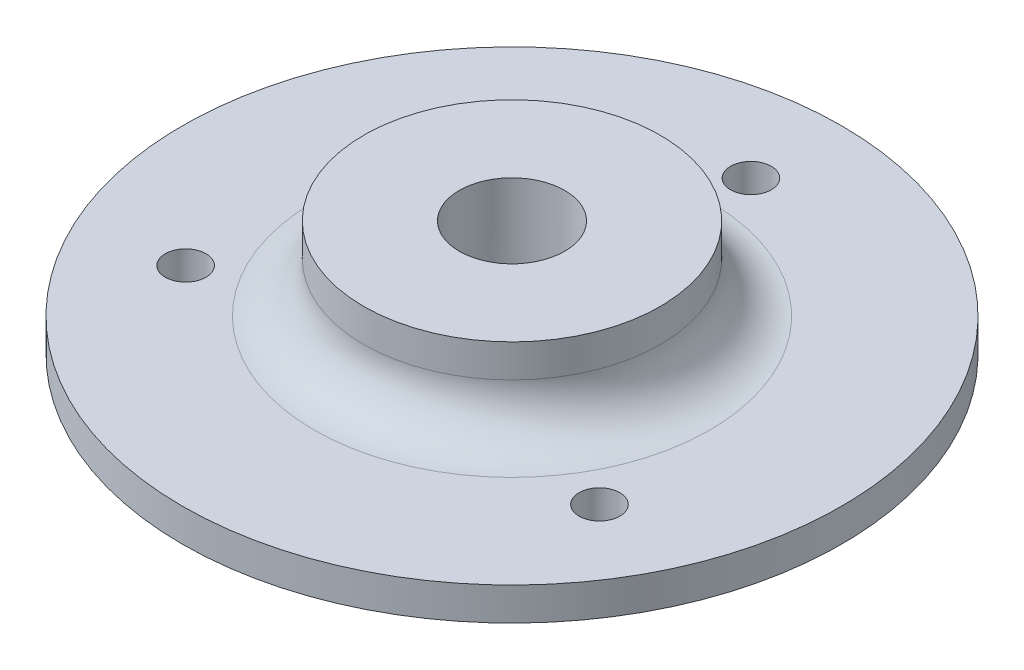
ISO-10303-21;
HEADER;
FILE_DESCRIPTION(('STEP AP214'),'2;1');
FILE_NAME('part.step','',(''),(''),'','','');
FILE_SCHEMA(('AUTOMOTIVE_DESIGN { 1 0 10303 214 1 1 1 1 }'));
ENDSEC;
DATA;
#1=APPLICATION_CONTEXT('core data for automotive mechanical design processes');
#2=APPLICATION_PROTOCOL_DEFINITION('international standard','automotive_design',2000,#1);
#3=PRODUCT_CONTEXT('',#1,'mechanical');
#4=PRODUCT('Part','Part','',(#3));
#5=PRODUCT_RELATED_PRODUCT_CATEGORY('part','',(#4));
#6=PRODUCT_DEFINITION_FORMATION('','',#4);
#7=PRODUCT_DEFINITION_CONTEXT('part definition',#1,'design');
#8=PRODUCT_DEFINITION('design','',#6,#7);
#9=PRODUCT_DEFINITION_SHAPE('','',#8);
#10=(LENGTH_UNIT() NAMED_UNIT(*) SI_UNIT(.MILLI.,.METRE.));
#11=(NAMED_UNIT(*) PLANE_ANGLE_UNIT() SI_UNIT($,.RADIAN.));
#12=(NAMED_UNIT(*) SI_UNIT($,.STERADIAN.) SOLID_ANGLE_UNIT());
#13=UNCERTAINTY_MEASURE_WITH_UNIT(LENGTH_MEASURE(1.E-05),#10,'distance_accuracy_value','');
#14=(GEOMETRIC_REPRESENTATION_CONTEXT(3) GLOBAL_UNCERTAINTY_ASSIGNED_CONTEXT((#13)) GLOBAL_UNIT_ASSIGNED_CONTEXT((#10,
#11,#12)) REPRESENTATION_CONTEXT('',''));
#15=CARTESIAN_POINT('',(0.,0.,0.));
#16=DIRECTION('',(0.,0.,1.));
#17=DIRECTION('',(1.,0.,0.));
#18=AXIS2_PLACEMENT_3D('',#15,#16,#17);
#19=CARTESIAN_POINT('',(0.,0.,-5.8));
#20=DIRECTION('',(0.,1.,0.));
#21=DIRECTION('',(0.,0.,1.));
#22=AXIS2_PLACEMENT_3D('',#19,#20,#21);
#23=PLANE('',#22);
#24=CARTESIAN_POINT('',(0.,0.,-9.));
#25=DIRECTION('',(0.,1.,0.));
#26=DIRECTION('',(0.,0.,1.));
#27=AXIS2_PLACEMENT_3D('',#24,#25,#26);
#28=CIRCLE('',#27,9.);
#29=CARTESIAN_POINT('',(0.,0.,0.));
#30=VERTEX_POINT('',#29);
#31=EDGE_CURVE('E55',#30,#30,#28,.T.);
#32=ORIENTED_EDGE('',*,*,#31,.T.);
#33=EDGE_LOOP('',(#32));
#34=FACE_BOUND('',#33,.T.);
#35=CARTESIAN_POINT('',(0.,0.,-9.));
#36=DIRECTION('',(0.,1.,0.));
#37=DIRECTION('',(0.,0.,1.));
#38=AXIS2_PLACEMENT_3D('',#35,#36,#37);
#39=CIRCLE('',#38,3.2);
#40=CARTESIAN_POINT('',(0.,0.,-5.8));
#41=VERTEX_POINT('',#40);
#42=EDGE_CURVE('E67',#41,#41,#39,.T.);
#43=ORIENTED_EDGE('',*,*,#42,.F.);
#44=EDGE_LOOP('',(#43));
#45=FACE_BOUND('',#44,.T.);
#46=ADVANCED_FACE('F35',(#34,#45),#23,.T.);
#47=CARTESIAN_POINT('',(0.,1.65861486486489,-9.));
#48=DIRECTION('',(0.,1.,0.));
#49=DIRECTION('',(0.,0.,1.));
#50=AXIS2_PLACEMENT_3D('',#47,#48,#49);
#51=CYLINDRICAL_SURFACE('',#50,9.);
#52=CARTESIAN_POINT('',(0.,-1.99999999999999,-9.));
#53=DIRECTION('',(0.,1.,0.));
#54=DIRECTION('',(0.,0.,1.));
#55=AXIS2_PLACEMENT_3D('',#52,#53,#54);
#56=CIRCLE('',#55,9.);
#57=CARTESIAN_POINT('',(0.,-2.,0.));
#58=VERTEX_POINT('',#57);
#59=EDGE_CURVE('E50',#58,#58,#56,.T.);
#60=ORIENTED_EDGE('',*,*,#59,.T.);
#61=EDGE_LOOP('',(#60));
#62=FACE_BOUND('',#61,.T.);
#63=ORIENTED_EDGE('',*,*,#31,.F.);
#64=EDGE_LOOP('',(#63));
#65=FACE_BOUND('',#64,.T.);
#66=ADVANCED_FACE('F104',(#62,#65),#51,.T.);
#67=CARTESIAN_POINT('',(0.,-5.,0.));
#68=DIRECTION('',(0.,1.,0.));
#69=DIRECTION('',(0.,0.,1.));
#70=AXIS2_PLACEMENT_3D('',#67,#68,#69);
#71=PLANE('',#70);
#72=CARTESIAN_POINT('',(0.,-5.,-9.));
#73=DIRECTION('',(0.,1.,0.));
#74=DIRECTION('',(0.,0.,1.));
#75=AXIS2_PLACEMENT_3D('',#72,#73,#74);
#76=CIRCLE('',#75,12.);
#77=CARTESIAN_POINT('',(0.,-5.,3.));
#78=VERTEX_POINT('',#77);
#79=EDGE_CURVE('E46',#78,#78,#76,.F.);
#80=ORIENTED_EDGE('',*,*,#79,.T.);
#81=EDGE_LOOP('',(#80));
#82=FACE_BOUND('',#81,.T.);
#83=CARTESIAN_POINT('',(-12.5573683548743,-5.,-1.74999999999994));
#84=DIRECTION('',(0.,1.,0.));
#85=DIRECTION('',(0.866025403784436,0.,-0.500000000000004));
#86=AXIS2_PLACEMENT_3D('',#83,#84,#85);
#87=CIRCLE('',#86,1.23701306055364);
#88=CARTESIAN_POINT('',(-11.4860836196217,-5.,-2.36850653027676));
#89=VERTEX_POINT('',#88);
#90=EDGE_CURVE('E83',#89,#89,#87,.T.);
#91=ORIENTED_EDGE('',*,*,#90,.F.);
#92=EDGE_LOOP('',(#91));
#93=FACE_BOUND('',#92,.T.);
#94=CARTESIAN_POINT('',(12.5573683548744,-5.,-1.75000000000012));
#95=DIRECTION('',(0.,1.,0.));
#96=DIRECTION('',(-0.866025403784443,0.,-0.499999999999992));
#97=AXIS2_PLACEMENT_3D('',#94,#95,#96);
#98=CIRCLE('',#97,1.23701306055364);
#99=CARTESIAN_POINT('',(11.4860836196218,-5.,-2.36850653027692));
#100=VERTEX_POINT('',#99);
#101=EDGE_CURVE('E77',#100,#100,#98,.T.);
#102=ORIENTED_EDGE('',*,*,#101,.F.);
#103=EDGE_LOOP('',(#102));
#104=FACE_BOUND('',#103,.T.);
#105=CARTESIAN_POINT('',(0.,-4.99999999999999,-23.5));
#106=DIRECTION('',(0.,1.,0.));
#107=DIRECTION('',(0.,0.,1.));
#108=AXIS2_PLACEMENT_3D('',#105,#106,#107);
#109=CIRCLE('',#108,1.23701306055364);
#110=CARTESIAN_POINT('',(0.,-4.99999999999999,-22.2629869394464));
#111=VERTEX_POINT('',#110);
#112=EDGE_CURVE('E71',#111,#111,#109,.T.);
#113=ORIENTED_EDGE('',*,*,#112,.F.);
#114=EDGE_LOOP('',(#113));
#115=FACE_BOUND('',#114,.T.);
#116=CARTESIAN_POINT('',(0.,-5.,-9.));
#117=DIRECTION('',(0.,1.,0.));
#118=DIRECTION('',(0.,0.,1.));
#119=AXIS2_PLACEMENT_3D('',#116,#117,#118);
#120=CIRCLE('',#119,20.);
#121=CARTESIAN_POINT('',(0.,-5.,11.));
#122=VERTEX_POINT('',#121);
#123=EDGE_CURVE('E58',#122,#122,#120,.T.);
#124=ORIENTED_EDGE('',*,*,#123,.T.);
#125=EDGE_LOOP('',(#124));
#126=FACE_BOUND('',#125,.T.);
#127=ADVANCED_FACE('F100',(#82,#93,#104,#115,#126),#71,.T.);
#128=CARTESIAN_POINT('',(0.,1.65861486486489,-9.));
#129=DIRECTION('',(0.,1.,0.));
#130=DIRECTION('',(0.,0.,1.));
#131=AXIS2_PLACEMENT_3D('',#128,#129,#130);
#132=CYLINDRICAL_SURFACE('',#131,20.);
#133=CARTESIAN_POINT('',(0.,-7.,-9.));
#134=DIRECTION('',(0.,1.,0.));
#135=DIRECTION('',(0.,0.,1.));
#136=AXIS2_PLACEMENT_3D('',#133,#134,#135);
#137=CIRCLE('',#136,20.);
#138=CARTESIAN_POINT('',(0.,-7.,11.));
#139=VERTEX_POINT('',#138);
#140=EDGE_CURVE('E61',#139,#139,#137,.T.);
#141=ORIENTED_EDGE('',*,*,#140,.T.);
#142=EDGE_LOOP('',(#141));
#143=FACE_BOUND('',#142,.T.);
#144=ORIENTED_EDGE('',*,*,#123,.F.);
#145=EDGE_LOOP('',(#144));
#146=FACE_BOUND('',#145,.T.);
#147=ADVANCED_FACE('F103',(#143,#146),#132,.T.);
#148=CARTESIAN_POINT('',(0.,-7.,11.));
#149=DIRECTION('',(0.,-1.,0.));
#150=DIRECTION('',(0.,0.,-1.));
#151=AXIS2_PLACEMENT_3D('',#148,#149,#150);
#152=PLANE('',#151);
#153=CARTESIAN_POINT('',(-12.5573683548743,-7.,-1.74999999999994));
#154=DIRECTION('',(0.,1.,0.));
#155=DIRECTION('',(0.866025403784436,0.,-0.500000000000004));
#156=AXIS2_PLACEMENT_3D('',#153,#154,#155);
#157=CIRCLE('',#156,1.23701306055364);
#158=CARTESIAN_POINT('',(-11.4860836196217,-7.,-2.36850653027676));
#159=VERTEX_POINT('',#158);
#160=EDGE_CURVE('E74',#159,#159,#157,.T.);
#161=ORIENTED_EDGE('',*,*,#160,.T.);
#162=EDGE_LOOP('',(#161));
#163=FACE_BOUND('',#162,.T.);
#164=CARTESIAN_POINT('',(12.5573683548744,-7.,-1.75000000000012));
#165=DIRECTION('',(0.,1.,0.));
#166=DIRECTION('',(-0.866025403784443,0.,-0.499999999999992));
#167=AXIS2_PLACEMENT_3D('',#164,#165,#166);
#168=CIRCLE('',#167,1.23701306055364);
#169=CARTESIAN_POINT('',(11.4860836196218,-7.,-2.36850653027692));
#170=VERTEX_POINT('',#169);
#171=EDGE_CURVE('E80',#170,#170,#168,.T.);
#172=ORIENTED_EDGE('',*,*,#171,.T.);
#173=EDGE_LOOP('',(#172));
#174=FACE_BOUND('',#173,.T.);
#175=CARTESIAN_POINT('',(0.,-7.,-23.5));
#176=DIRECTION('',(0.,1.,0.));
#177=DIRECTION('',(0.,0.,1.));
#178=AXIS2_PLACEMENT_3D('',#175,#176,#177);
#179=CIRCLE('',#178,1.23701306055364);
#180=CARTESIAN_POINT('',(0.,-7.,-22.2629869394464));
#181=VERTEX_POINT('',#180);
#182=EDGE_CURVE('E70',#181,#181,#179,.T.);
#183=ORIENTED_EDGE('',*,*,#182,.T.);
#184=EDGE_LOOP('',(#183));
#185=FACE_BOUND('',#184,.T.);
#186=CARTESIAN_POINT('',(0.,-7.,-9.));
#187=DIRECTION('',(0.,1.,0.));
#188=DIRECTION('',(0.,0.,1.));
#189=AXIS2_PLACEMENT_3D('',#186,#187,#188);
#190=CIRCLE('',#189,5.19999999999997);
#191=CARTESIAN_POINT('',(0.,-7.,-3.80000000000003));
#192=VERTEX_POINT('',#191);
#193=EDGE_CURVE('E64',#192,#192,#190,.T.);
#194=ORIENTED_EDGE('',*,*,#193,.T.);
#195=EDGE_LOOP('',(#194));
#196=FACE_BOUND('',#195,.T.);
#197=ORIENTED_EDGE('',*,*,#140,.F.);
#198=EDGE_LOOP('',(#197));
#199=FACE_BOUND('',#198,.T.);
#200=ADVANCED_FACE('F89',(#163,#174,#185,#196,#199),#152,.T.);
#201=CARTESIAN_POINT('',(0.,-7.,-9.));
#202=DIRECTION('',(0.,-1.,0.));
#203=DIRECTION('',(0.,0.,-1.));
#204=AXIS2_PLACEMENT_3D('',#201,#202,#203);
#205=CONICAL_SURFACE('',#204,5.19999999999997,0.785398163397443);
#206=CARTESIAN_POINT('',(0.,-5.29289321881345,-9.));
#207=DIRECTION('',(0.,1.,0.));
#208=DIRECTION('',(0.,0.,1.));
#209=AXIS2_PLACEMENT_3D('',#206,#207,#208);
#210=CIRCLE('',#209,3.49289321881345);
#211=CARTESIAN_POINT('',(0.,-5.29289321881345,-5.50710678118655));
#212=VERTEX_POINT('',#211);
#213=EDGE_CURVE('E42',#212,#212,#210,.T.);
#214=ORIENTED_EDGE('',*,*,#213,.T.);
#215=EDGE_LOOP('',(#214));
#216=FACE_BOUND('',#215,.T.);
#217=ORIENTED_EDGE('',*,*,#193,.F.);
#218=EDGE_LOOP('',(#217));
#219=FACE_BOUND('',#218,.T.);
#220=ADVANCED_FACE('F119',(#216,#219),#205,.F.);
#221=CARTESIAN_POINT('',(0.,1.65861486486489,-9.));
#222=DIRECTION('',(0.,1.,0.));
#223=DIRECTION('',(0.,0.,1.));
#224=AXIS2_PLACEMENT_3D('',#221,#222,#223);
#225=CYLINDRICAL_SURFACE('',#224,3.2);
#226=CARTESIAN_POINT('',(0.,-4.58578643762691,-9.));
#227=DIRECTION('',(0.,-1.,0.));
#228=DIRECTION('',(0.,0.,-1.));
#229=AXIS2_PLACEMENT_3D('',#226,#227,#228);
#230=CIRCLE('',#229,3.2);
#231=CARTESIAN_POINT('',(0.,-4.58578643762691,-12.2));
#232=VERTEX_POINT('',#231);
#233=EDGE_CURVE('E10',#232,#232,#230,.T.);
#234=ORIENTED_EDGE('',*,*,#233,.T.);
#235=EDGE_LOOP('',(#234));
#236=FACE_BOUND('',#235,.T.);
#237=ORIENTED_EDGE('',*,*,#42,.T.);
#238=EDGE_LOOP('',(#237));
#239=FACE_BOUND('',#238,.T.);
#240=ADVANCED_FACE('F151',(#236,#239),#225,.F.);
#241=CARTESIAN_POINT('',(0.,-7.,-23.5));
#242=DIRECTION('',(0.,1.,0.));
#243=DIRECTION('',(0.,0.,1.));
#244=AXIS2_PLACEMENT_3D('',#241,#242,#243);
#245=CYLINDRICAL_SURFACE('',#244,1.23701306055364);
#246=ORIENTED_EDGE('',*,*,#182,.F.);
#247=EDGE_LOOP('',(#246));
#248=FACE_BOUND('',#247,.T.);
#249=ORIENTED_EDGE('',*,*,#112,.T.);
#250=EDGE_LOOP('',(#249));
#251=FACE_BOUND('',#250,.T.);
#252=ADVANCED_FACE('F156',(#248,#251),#245,.F.);
#253=CARTESIAN_POINT('',(12.5573683548744,-7.,-1.75000000000012));
#254=DIRECTION('',(0.,1.,0.));
#255=DIRECTION('',(0.,0.,1.));
#256=AXIS2_PLACEMENT_3D('',#253,#254,#255);
#257=CYLINDRICAL_SURFACE('',#256,1.23701306055364);
#258=ORIENTED_EDGE('',*,*,#171,.F.);
#259=EDGE_LOOP('',(#258));
#260=FACE_BOUND('',#259,.T.);
#261=ORIENTED_EDGE('',*,*,#101,.T.);
#262=EDGE_LOOP('',(#261));
#263=FACE_BOUND('',#262,.T.);
#264=ADVANCED_FACE('F96',(#260,#263),#257,.F.);
#265=CARTESIAN_POINT('',(-12.5573683548743,-7.,-1.74999999999994));
#266=DIRECTION('',(0.,1.,0.));
#267=DIRECTION('',(0.,0.,1.));
#268=AXIS2_PLACEMENT_3D('',#265,#266,#267);
#269=CYLINDRICAL_SURFACE('',#268,1.23701306055364);
#270=ORIENTED_EDGE('',*,*,#160,.F.);
#271=EDGE_LOOP('',(#270));
#272=FACE_BOUND('',#271,.T.);
#273=ORIENTED_EDGE('',*,*,#90,.T.);
#274=EDGE_LOOP('',(#273));
#275=FACE_BOUND('',#274,.T.);
#276=ADVANCED_FACE('F92',(#272,#275),#269,.F.);
#277=CARTESIAN_POINT('',(0.,-1.99999999999999,-9.));
#278=DIRECTION('',(0.,1.,0.));
#279=DIRECTION('',(0.,0.,1.));
#280=AXIS2_PLACEMENT_3D('',#277,#278,#279);
#281=TOROIDAL_SURFACE('',#280,12.,3.);
#282=ORIENTED_EDGE('',*,*,#79,.F.);
#283=EDGE_LOOP('',(#282));
#284=FACE_BOUND('',#283,.T.);
#285=ORIENTED_EDGE('',*,*,#59,.F.);
#286=EDGE_LOOP('',(#285));
#287=FACE_BOUND('',#286,.T.);
#288=ADVANCED_FACE('F95',(#284,#287),#281,.F.);
#289=CARTESIAN_POINT('',(0.,-4.58578643762691,-9.));
#290=DIRECTION('',(0.,-1.,0.));
#291=DIRECTION('',(0.,0.,-1.));
#292=AXIS2_PLACEMENT_3D('',#289,#290,#291);
#293=TOROIDAL_SURFACE('',#292,4.2,1.);
#294=ORIENTED_EDGE('',*,*,#233,.F.);
#295=EDGE_LOOP('',(#294));
#296=FACE_BOUND('',#295,.T.);
#297=ORIENTED_EDGE('',*,*,#213,.F.);
#298=EDGE_LOOP('',(#297));
#299=FACE_BOUND('',#298,.T.);
#300=ADVANCED_FACE('F37',(#296,#299),#293,.T.);
#301=CLOSED_SHELL('',(#46,#66,#127,#147,#200,#220,#240,#252,#264,#276,#288,#300));
#302=MANIFOLD_SOLID_BREP('B2',#301);
#303=ADVANCED_BREP_SHAPE_REPRESENTATION('',(#18,#302),#14);
#304=SHAPE_DEFINITION_REPRESENTATION(#9,#303);
ENDSEC;
END-ISO-10303-21;
